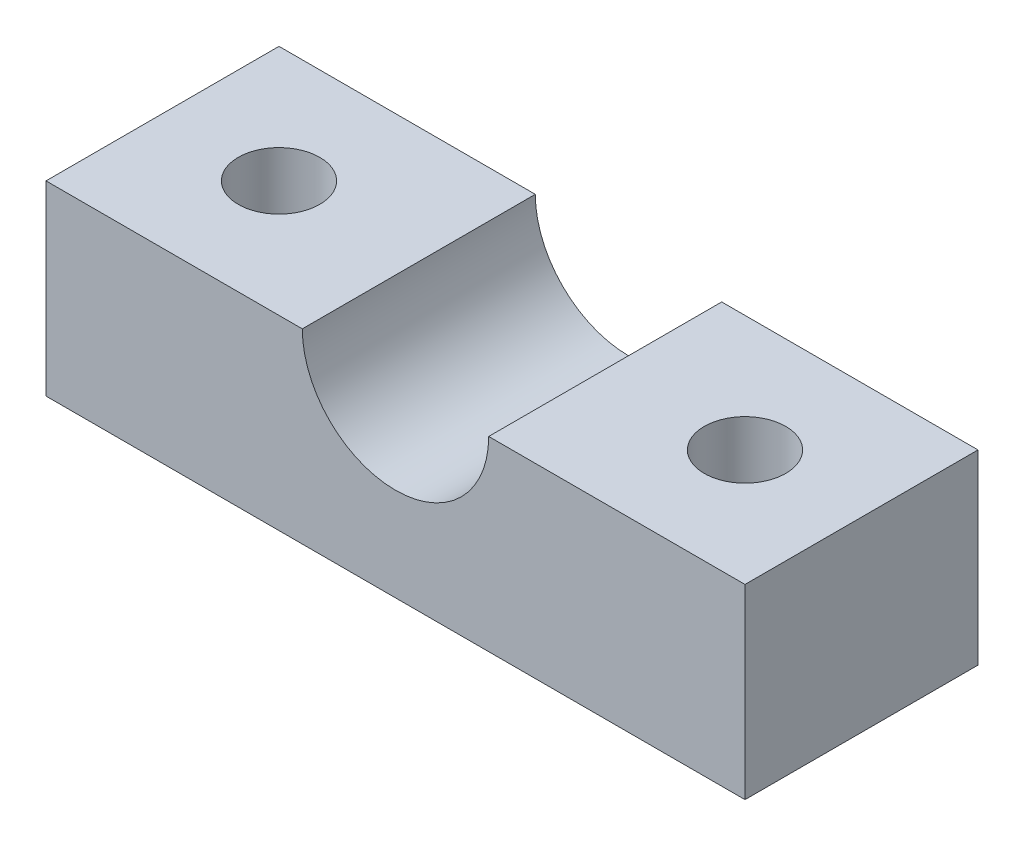
ISO-10303-21;
HEADER;
FILE_DESCRIPTION(('STEP AP214'),'2;1');
FILE_NAME('part.step','',(''),(''),'','','');
FILE_SCHEMA(('AUTOMOTIVE_DESIGN { 1 0 10303 214 1 1 1 1 }'));
ENDSEC;
DATA;
#1=APPLICATION_CONTEXT('core data for automotive mechanical design processes');
#2=APPLICATION_PROTOCOL_DEFINITION('international standard','automotive_design',2000,#1);
#3=PRODUCT_CONTEXT('',#1,'mechanical');
#4=PRODUCT('Part','Part','',(#3));
#5=PRODUCT_RELATED_PRODUCT_CATEGORY('part','',(#4));
#6=PRODUCT_DEFINITION_FORMATION('','',#4);
#7=PRODUCT_DEFINITION_CONTEXT('part definition',#1,'design');
#8=PRODUCT_DEFINITION('design','',#6,#7);
#9=PRODUCT_DEFINITION_SHAPE('','',#8);
#10=(LENGTH_UNIT() NAMED_UNIT(*) SI_UNIT(.MILLI.,.METRE.));
#11=(NAMED_UNIT(*) PLANE_ANGLE_UNIT() SI_UNIT($,.RADIAN.));
#12=(NAMED_UNIT(*) SI_UNIT($,.STERADIAN.) SOLID_ANGLE_UNIT());
#13=UNCERTAINTY_MEASURE_WITH_UNIT(LENGTH_MEASURE(1.E-05),#10,'distance_accuracy_value','');
#14=(GEOMETRIC_REPRESENTATION_CONTEXT(3) GLOBAL_UNCERTAINTY_ASSIGNED_CONTEXT((#13)) GLOBAL_UNIT_ASSIGNED_CONTEXT((#10,
#11,#12)) REPRESENTATION_CONTEXT('',''));
#15=CARTESIAN_POINT('',(0.,0.,0.));
#16=DIRECTION('',(0.,0.,1.));
#17=DIRECTION('',(1.,0.,0.));
#18=AXIS2_PLACEMENT_3D('',#15,#16,#17);
#19=CARTESIAN_POINT('',(0.,0.,10.));
#20=DIRECTION('',(1.,0.,0.));
#21=DIRECTION('',(0.,0.,-1.));
#22=AXIS2_PLACEMENT_3D('',#19,#20,#21);
#23=PLANE('',#22);
#24=DIRECTION('',(0.,-1.,0.));
#25=VECTOR('',#24,1.);
#26=CARTESIAN_POINT('',(0.,0.,0.));
#27=LINE('',#26,#25);
#28=CARTESIAN_POINT('',(0.,8.,0.));
#29=VERTEX_POINT('',#28);
#30=CARTESIAN_POINT('',(0.,0.,0.));
#31=VERTEX_POINT('',#30);
#32=EDGE_CURVE('E128',#29,#31,#27,.T.);
#33=ORIENTED_EDGE('',*,*,#32,.T.);
#34=DIRECTION('',(0.,0.,-1.));
#35=VECTOR('',#34,1.);
#36=CARTESIAN_POINT('',(0.,0.,10.));
#37=LINE('',#36,#35);
#38=CARTESIAN_POINT('',(0.,0.,10.));
#39=VERTEX_POINT('',#38);
#40=EDGE_CURVE('E11',#39,#31,#37,.T.);
#41=ORIENTED_EDGE('',*,*,#40,.F.);
#42=DIRECTION('',(0.,-1.,0.));
#43=VECTOR('',#42,1.);
#44=CARTESIAN_POINT('',(0.,0.,10.));
#45=LINE('',#44,#43);
#46=CARTESIAN_POINT('',(0.,8.,10.));
#47=VERTEX_POINT('',#46);
#48=EDGE_CURVE('E145',#47,#39,#45,.T.);
#49=ORIENTED_EDGE('',*,*,#48,.F.);
#50=DIRECTION('',(0.,0.,-1.));
#51=VECTOR('',#50,1.);
#52=CARTESIAN_POINT('',(0.,8.,10.));
#53=LINE('',#52,#51);
#54=EDGE_CURVE('E124',#47,#29,#53,.T.);
#55=ORIENTED_EDGE('',*,*,#54,.T.);
#56=EDGE_LOOP('',(#33,#41,#49,#55));
#57=FACE_BOUND('',#56,.T.);
#58=ADVANCED_FACE('F39',(#57),#23,.F.);
#59=CARTESIAN_POINT('',(0.,0.,10.));
#60=DIRECTION('',(0.,1.,0.));
#61=DIRECTION('',(0.,0.,1.));
#62=AXIS2_PLACEMENT_3D('',#59,#60,#61);
#63=PLANE('',#62);
#64=CARTESIAN_POINT('',(5.,0.,5.));
#65=DIRECTION('',(0.,-1.,0.));
#66=DIRECTION('',(0.,0.,-1.));
#67=AXIS2_PLACEMENT_3D('',#64,#65,#66);
#68=CIRCLE('',#67,1.74999999999999);
#69=CARTESIAN_POINT('',(5.,0.,3.25000000000001));
#70=VERTEX_POINT('',#69);
#71=EDGE_CURVE('E209',#70,#70,#68,.T.);
#72=ORIENTED_EDGE('',*,*,#71,.F.);
#73=EDGE_LOOP('',(#72));
#74=FACE_BOUND('',#73,.T.);
#75=CARTESIAN_POINT('',(25.,0.,5.));
#76=DIRECTION('',(0.,-1.,0.));
#77=DIRECTION('',(0.,0.,-1.));
#78=AXIS2_PLACEMENT_3D('',#75,#76,#77);
#79=CIRCLE('',#78,1.74999999999999);
#80=CARTESIAN_POINT('',(25.,0.,3.25000000000001));
#81=VERTEX_POINT('',#80);
#82=EDGE_CURVE('E195',#81,#81,#79,.T.);
#83=ORIENTED_EDGE('',*,*,#82,.F.);
#84=EDGE_LOOP('',(#83));
#85=FACE_BOUND('',#84,.T.);
#86=DIRECTION('',(1.,0.,0.));
#87=VECTOR('',#86,1.);
#88=CARTESIAN_POINT('',(0.,0.,0.));
#89=LINE('',#88,#87);
#90=CARTESIAN_POINT('',(30.,0.,0.));
#91=VERTEX_POINT('',#90);
#92=EDGE_CURVE('E132',#31,#91,#89,.T.);
#93=ORIENTED_EDGE('',*,*,#92,.T.);
#94=DIRECTION('',(0.,0.,-1.));
#95=VECTOR('',#94,1.);
#96=CARTESIAN_POINT('',(30.,0.,10.));
#97=LINE('',#96,#95);
#98=CARTESIAN_POINT('',(30.,0.,10.));
#99=VERTEX_POINT('',#98);
#100=EDGE_CURVE('E48',#99,#91,#97,.T.);
#101=ORIENTED_EDGE('',*,*,#100,.F.);
#102=DIRECTION('',(1.,0.,0.));
#103=VECTOR('',#102,1.);
#104=CARTESIAN_POINT('',(0.,0.,10.));
#105=LINE('',#104,#103);
#106=EDGE_CURVE('E93',#39,#99,#105,.T.);
#107=ORIENTED_EDGE('',*,*,#106,.F.);
#108=ORIENTED_EDGE('',*,*,#40,.T.);
#109=EDGE_LOOP('',(#93,#101,#107,#108));
#110=FACE_BOUND('',#109,.T.);
#111=ADVANCED_FACE('F175',(#74,#85,#110),#63,.F.);
#112=CARTESIAN_POINT('',(30.,0.,10.));
#113=DIRECTION('',(-1.,0.,0.));
#114=DIRECTION('',(0.,0.,1.));
#115=AXIS2_PLACEMENT_3D('',#112,#113,#114);
#116=PLANE('',#115);
#117=DIRECTION('',(0.,1.,0.));
#118=VECTOR('',#117,1.);
#119=CARTESIAN_POINT('',(30.,0.,0.));
#120=LINE('',#119,#118);
#121=CARTESIAN_POINT('',(30.,8.,0.));
#122=VERTEX_POINT('',#121);
#123=EDGE_CURVE('E136',#91,#122,#120,.T.);
#124=ORIENTED_EDGE('',*,*,#123,.T.);
#125=DIRECTION('',(0.,0.,-1.));
#126=VECTOR('',#125,1.);
#127=CARTESIAN_POINT('',(30.,8.,10.));
#128=LINE('',#127,#126);
#129=CARTESIAN_POINT('',(30.,8.,10.));
#130=VERTEX_POINT('',#129);
#131=EDGE_CURVE('E117',#130,#122,#128,.T.);
#132=ORIENTED_EDGE('',*,*,#131,.F.);
#133=DIRECTION('',(0.,1.,0.));
#134=VECTOR('',#133,1.);
#135=CARTESIAN_POINT('',(30.,0.,10.));
#136=LINE('',#135,#134);
#137=EDGE_CURVE('E106',#99,#130,#136,.T.);
#138=ORIENTED_EDGE('',*,*,#137,.F.);
#139=ORIENTED_EDGE('',*,*,#100,.T.);
#140=EDGE_LOOP('',(#124,#132,#138,#139));
#141=FACE_BOUND('',#140,.T.);
#142=ADVANCED_FACE('F155',(#141),#116,.F.);
#143=CARTESIAN_POINT('',(19.,8.,10.));
#144=DIRECTION('',(0.,-1.,0.));
#145=DIRECTION('',(0.,0.,-1.));
#146=AXIS2_PLACEMENT_3D('',#143,#144,#145);
#147=PLANE('',#146);
#148=CARTESIAN_POINT('',(25.,8.,5.));
#149=DIRECTION('',(0.,-1.,0.));
#150=DIRECTION('',(0.,0.,-1.));
#151=AXIS2_PLACEMENT_3D('',#148,#149,#150);
#152=CIRCLE('',#151,1.74999999999999);
#153=CARTESIAN_POINT('',(25.,8.,3.25000000000001));
#154=VERTEX_POINT('',#153);
#155=EDGE_CURVE('E133',#154,#154,#152,.T.);
#156=ORIENTED_EDGE('',*,*,#155,.T.);
#157=EDGE_LOOP('',(#156));
#158=FACE_BOUND('',#157,.T.);
#159=DIRECTION('',(-1.,0.,0.));
#160=VECTOR('',#159,1.);
#161=CARTESIAN_POINT('',(19.,8.,0.));
#162=LINE('',#161,#160);
#163=CARTESIAN_POINT('',(19.,8.,0.));
#164=VERTEX_POINT('',#163);
#165=EDGE_CURVE('E115',#122,#164,#162,.T.);
#166=ORIENTED_EDGE('',*,*,#165,.T.);
#167=DIRECTION('',(0.,0.,-1.));
#168=VECTOR('',#167,1.);
#169=CARTESIAN_POINT('',(19.,8.,10.));
#170=LINE('',#169,#168);
#171=CARTESIAN_POINT('',(19.,8.,10.));
#172=VERTEX_POINT('',#171);
#173=EDGE_CURVE('E112',#172,#164,#170,.T.);
#174=ORIENTED_EDGE('',*,*,#173,.F.);
#175=DIRECTION('',(-1.,0.,0.));
#176=VECTOR('',#175,1.);
#177=CARTESIAN_POINT('',(19.,8.,10.));
#178=LINE('',#177,#176);
#179=EDGE_CURVE('E100',#130,#172,#178,.T.);
#180=ORIENTED_EDGE('',*,*,#179,.F.);
#181=ORIENTED_EDGE('',*,*,#131,.T.);
#182=EDGE_LOOP('',(#166,#174,#180,#181));
#183=FACE_BOUND('',#182,.T.);
#184=ADVANCED_FACE('F113',(#158,#183),#147,.F.);
#185=CARTESIAN_POINT('',(15.,8.,10.));
#186=DIRECTION('',(0.,0.,-1.));
#187=DIRECTION('',(-1.,0.,0.));
#188=AXIS2_PLACEMENT_3D('',#185,#186,#187);
#189=CYLINDRICAL_SURFACE('',#188,4.);
#190=CARTESIAN_POINT('',(15.,8.,0.));
#191=DIRECTION('',(0.,0.,-1.));
#192=DIRECTION('',(1.,0.,0.));
#193=AXIS2_PLACEMENT_3D('',#190,#191,#192);
#194=CIRCLE('',#193,4.);
#195=CARTESIAN_POINT('',(11.,8.,0.));
#196=VERTEX_POINT('',#195);
#197=EDGE_CURVE('E79',#164,#196,#194,.T.);
#198=ORIENTED_EDGE('',*,*,#197,.T.);
#199=DIRECTION('',(0.,0.,-1.));
#200=VECTOR('',#199,1.);
#201=CARTESIAN_POINT('',(11.,8.,10.));
#202=LINE('',#201,#200);
#203=CARTESIAN_POINT('',(11.,8.,10.));
#204=VERTEX_POINT('',#203);
#205=EDGE_CURVE('E118',#204,#196,#202,.T.);
#206=ORIENTED_EDGE('',*,*,#205,.F.);
#207=CARTESIAN_POINT('',(15.,8.,10.));
#208=DIRECTION('',(0.,0.,-1.));
#209=DIRECTION('',(1.,0.,0.));
#210=AXIS2_PLACEMENT_3D('',#207,#208,#209);
#211=CIRCLE('',#210,4.);
#212=EDGE_CURVE('E104',#172,#204,#211,.T.);
#213=ORIENTED_EDGE('',*,*,#212,.F.);
#214=ORIENTED_EDGE('',*,*,#173,.T.);
#215=EDGE_LOOP('',(#198,#206,#213,#214));
#216=FACE_BOUND('',#215,.T.);
#217=ADVANCED_FACE('F120',(#216),#189,.F.);
#218=CARTESIAN_POINT('',(0.,8.,10.));
#219=DIRECTION('',(0.,-1.,0.));
#220=DIRECTION('',(0.,0.,-1.));
#221=AXIS2_PLACEMENT_3D('',#218,#219,#220);
#222=PLANE('',#221);
#223=CARTESIAN_POINT('',(5.,8.,5.));
#224=DIRECTION('',(0.,-1.,0.));
#225=DIRECTION('',(0.,0.,-1.));
#226=AXIS2_PLACEMENT_3D('',#223,#224,#225);
#227=CIRCLE('',#226,1.74999999999999);
#228=CARTESIAN_POINT('',(5.,8.,3.25000000000001));
#229=VERTEX_POINT('',#228);
#230=EDGE_CURVE('E199',#229,#229,#227,.T.);
#231=ORIENTED_EDGE('',*,*,#230,.T.);
#232=EDGE_LOOP('',(#231));
#233=FACE_BOUND('',#232,.T.);
#234=DIRECTION('',(-1.,0.,0.));
#235=VECTOR('',#234,1.);
#236=CARTESIAN_POINT('',(0.,8.,0.));
#237=LINE('',#236,#235);
#238=EDGE_CURVE('E85',#196,#29,#237,.T.);
#239=ORIENTED_EDGE('',*,*,#238,.T.);
#240=ORIENTED_EDGE('',*,*,#54,.F.);
#241=DIRECTION('',(-1.,0.,0.));
#242=VECTOR('',#241,1.);
#243=CARTESIAN_POINT('',(0.,8.,10.));
#244=LINE('',#243,#242);
#245=EDGE_CURVE('E56',#204,#47,#244,.T.);
#246=ORIENTED_EDGE('',*,*,#245,.F.);
#247=ORIENTED_EDGE('',*,*,#205,.T.);
#248=EDGE_LOOP('',(#239,#240,#246,#247));
#249=FACE_BOUND('',#248,.T.);
#250=ADVANCED_FACE('F162',(#233,#249),#222,.F.);
#251=CARTESIAN_POINT('',(15.,8.,10.));
#252=DIRECTION('',(0.,0.,1.));
#253=DIRECTION('',(1.,0.,0.));
#254=AXIS2_PLACEMENT_3D('',#251,#252,#253);
#255=PLANE('',#254);
#256=ORIENTED_EDGE('',*,*,#48,.T.);
#257=ORIENTED_EDGE('',*,*,#106,.T.);
#258=ORIENTED_EDGE('',*,*,#137,.T.);
#259=ORIENTED_EDGE('',*,*,#179,.T.);
#260=ORIENTED_EDGE('',*,*,#212,.T.);
#261=ORIENTED_EDGE('',*,*,#245,.T.);
#262=EDGE_LOOP('',(#256,#257,#258,#259,#260,#261));
#263=FACE_BOUND('',#262,.T.);
#264=ADVANCED_FACE('F102',(#263),#255,.T.);
#265=CARTESIAN_POINT('',(15.,8.,0.));
#266=DIRECTION('',(0.,0.,1.));
#267=DIRECTION('',(1.,0.,0.));
#268=AXIS2_PLACEMENT_3D('',#265,#266,#267);
#269=PLANE('',#268);
#270=ORIENTED_EDGE('',*,*,#32,.F.);
#271=ORIENTED_EDGE('',*,*,#238,.F.);
#272=ORIENTED_EDGE('',*,*,#197,.F.);
#273=ORIENTED_EDGE('',*,*,#165,.F.);
#274=ORIENTED_EDGE('',*,*,#123,.F.);
#275=ORIENTED_EDGE('',*,*,#92,.F.);
#276=EDGE_LOOP('',(#270,#271,#272,#273,#274,#275));
#277=FACE_BOUND('',#276,.T.);
#278=ADVANCED_FACE('F158',(#277),#269,.F.);
#279=CARTESIAN_POINT('',(25.,0.,5.));
#280=DIRECTION('',(0.,-1.,0.));
#281=DIRECTION('',(0.,0.,-1.));
#282=AXIS2_PLACEMENT_3D('',#279,#280,#281);
#283=CYLINDRICAL_SURFACE('',#282,1.74999999999999);
#284=ORIENTED_EDGE('',*,*,#155,.F.);
#285=EDGE_LOOP('',(#284));
#286=FACE_BOUND('',#285,.T.);
#287=ORIENTED_EDGE('',*,*,#82,.T.);
#288=EDGE_LOOP('',(#287));
#289=FACE_BOUND('',#288,.T.);
#290=ADVANCED_FACE('F215',(#286,#289),#283,.F.);
#291=CARTESIAN_POINT('',(5.,0.,5.));
#292=DIRECTION('',(0.,-1.,0.));
#293=DIRECTION('',(0.,0.,-1.));
#294=AXIS2_PLACEMENT_3D('',#291,#292,#293);
#295=CYLINDRICAL_SURFACE('',#294,1.74999999999999);
#296=ORIENTED_EDGE('',*,*,#230,.F.);
#297=EDGE_LOOP('',(#296));
#298=FACE_BOUND('',#297,.T.);
#299=ORIENTED_EDGE('',*,*,#71,.T.);
#300=EDGE_LOOP('',(#299));
#301=FACE_BOUND('',#300,.T.);
#302=ADVANCED_FACE('F213',(#298,#301),#295,.F.);
#303=CLOSED_SHELL('',(#58,#111,#142,#184,#217,#250,#264,#278,#290,#302));
#304=MANIFOLD_SOLID_BREP('B2',#303);
#305=ADVANCED_BREP_SHAPE_REPRESENTATION('',(#18,#304),#14);
#306=SHAPE_DEFINITION_REPRESENTATION(#9,#305);
ENDSEC;
END-ISO-10303-21;
